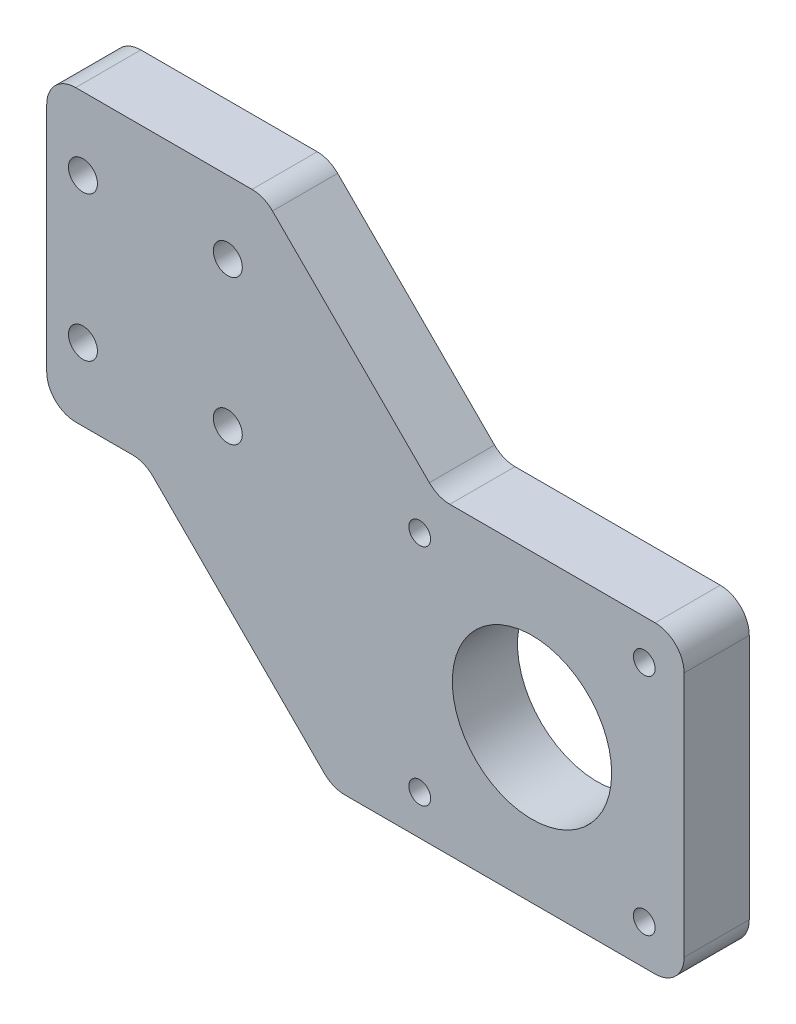
ISO-10303-21;
HEADER;
FILE_DESCRIPTION(('STEP AP214'),'2;1');
FILE_NAME('part.step','',(''),(''),'','','');
FILE_SCHEMA(('AUTOMOTIVE_DESIGN { 1 0 10303 214 1 1 1 1 }'));
ENDSEC;
DATA;
#1=APPLICATION_CONTEXT('core data for automotive mechanical design processes');
#2=APPLICATION_PROTOCOL_DEFINITION('international standard','automotive_design',2000,#1);
#3=PRODUCT_CONTEXT('',#1,'mechanical');
#4=PRODUCT('Part','Part','',(#3));
#5=PRODUCT_RELATED_PRODUCT_CATEGORY('part','',(#4));
#6=PRODUCT_DEFINITION_FORMATION('','',#4);
#7=PRODUCT_DEFINITION_CONTEXT('part definition',#1,'design');
#8=PRODUCT_DEFINITION('design','',#6,#7);
#9=PRODUCT_DEFINITION_SHAPE('','',#8);
#10=(LENGTH_UNIT() NAMED_UNIT(*) SI_UNIT(.MILLI.,.METRE.));
#11=(NAMED_UNIT(*) PLANE_ANGLE_UNIT() SI_UNIT($,.RADIAN.));
#12=(NAMED_UNIT(*) SI_UNIT($,.STERADIAN.) SOLID_ANGLE_UNIT());
#13=UNCERTAINTY_MEASURE_WITH_UNIT(LENGTH_MEASURE(1.E-05),#10,'distance_accuracy_value','');
#14=(GEOMETRIC_REPRESENTATION_CONTEXT(3) GLOBAL_UNCERTAINTY_ASSIGNED_CONTEXT((#13)) GLOBAL_UNIT_ASSIGNED_CONTEXT((#10,
#11,#12)) REPRESENTATION_CONTEXT('',''));
#15=CARTESIAN_POINT('',(0.,0.,0.));
#16=DIRECTION('',(0.,0.,1.));
#17=DIRECTION('',(1.,0.,0.));
#18=AXIS2_PLACEMENT_3D('',#15,#16,#17);
#19=CARTESIAN_POINT('',(0.,0.,9.));
#20=DIRECTION('',(1.,0.,0.));
#21=DIRECTION('',(0.,0.,-1.));
#22=AXIS2_PLACEMENT_3D('',#19,#20,#21);
#23=PLANE('',#22);
#24=DIRECTION('',(0.,-1.,0.));
#25=VECTOR('',#24,1.);
#26=CARTESIAN_POINT('',(0.,0.,0.));
#27=LINE('',#26,#25);
#28=CARTESIAN_POINT('',(0.,64.,0.));
#29=VERTEX_POINT('',#28);
#30=CARTESIAN_POINT('',(0.,32.,0.));
#31=VERTEX_POINT('',#30);
#32=EDGE_CURVE('E249',#29,#31,#27,.T.);
#33=ORIENTED_EDGE('',*,*,#32,.T.);
#34=DIRECTION('',(0.,0.,1.));
#35=VECTOR('',#34,1.);
#36=CARTESIAN_POINT('',(0.,32.,9.));
#37=LINE('',#36,#35);
#38=CARTESIAN_POINT('',(0.,32.,9.));
#39=VERTEX_POINT('',#38);
#40=EDGE_CURVE('E302',#31,#39,#37,.T.);
#41=ORIENTED_EDGE('',*,*,#40,.T.);
#42=DIRECTION('',(0.,-1.,0.));
#43=VECTOR('',#42,1.);
#44=CARTESIAN_POINT('',(0.,0.,9.));
#45=LINE('',#44,#43);
#46=CARTESIAN_POINT('',(0.,64.,9.));
#47=VERTEX_POINT('',#46);
#48=EDGE_CURVE('E252',#47,#39,#45,.T.);
#49=ORIENTED_EDGE('',*,*,#48,.F.);
#50=DIRECTION('',(0.,0.,1.));
#51=VECTOR('',#50,1.);
#52=CARTESIAN_POINT('',(0.,64.,9.));
#53=LINE('',#52,#51);
#54=EDGE_CURVE('E300',#47,#29,#53,.F.);
#55=ORIENTED_EDGE('',*,*,#54,.T.);
#56=EDGE_LOOP('',(#33,#41,#49,#55));
#57=FACE_BOUND('',#56,.T.);
#58=ADVANCED_FACE('F32',(#57),#23,.F.);
#59=CARTESIAN_POINT('',(88.,0.,9.));
#60=DIRECTION('',(-1.,0.,0.));
#61=DIRECTION('',(0.,0.,1.));
#62=AXIS2_PLACEMENT_3D('',#59,#60,#61);
#63=PLANE('',#62);
#64=DIRECTION('',(0.,1.,0.));
#65=VECTOR('',#64,1.);
#66=CARTESIAN_POINT('',(88.,0.,9.));
#67=LINE('',#66,#65);
#68=CARTESIAN_POINT('',(88.,6.00000000000001,9.));
#69=VERTEX_POINT('',#68);
#70=CARTESIAN_POINT('',(88.,40.,9.));
#71=VERTEX_POINT('',#70);
#72=EDGE_CURVE('E255',#69,#71,#67,.T.);
#73=ORIENTED_EDGE('',*,*,#72,.F.);
#74=DIRECTION('',(0.,0.,1.));
#75=VECTOR('',#74,1.);
#76=CARTESIAN_POINT('',(88.,6.00000000000001,9.));
#77=LINE('',#76,#75);
#78=CARTESIAN_POINT('',(88.,6.00000000000001,0.));
#79=VERTEX_POINT('',#78);
#80=EDGE_CURVE('E150',#69,#79,#77,.F.);
#81=ORIENTED_EDGE('',*,*,#80,.T.);
#82=DIRECTION('',(0.,1.,0.));
#83=VECTOR('',#82,1.);
#84=CARTESIAN_POINT('',(88.,0.,0.));
#85=LINE('',#84,#83);
#86=CARTESIAN_POINT('',(88.,40.,0.));
#87=VERTEX_POINT('',#86);
#88=EDGE_CURVE('E256',#79,#87,#85,.T.);
#89=ORIENTED_EDGE('',*,*,#88,.T.);
#90=DIRECTION('',(0.,0.,1.));
#91=VECTOR('',#90,1.);
#92=CARTESIAN_POINT('',(88.,40.,9.));
#93=LINE('',#92,#91);
#94=EDGE_CURVE('E155',#87,#71,#93,.T.);
#95=ORIENTED_EDGE('',*,*,#94,.T.);
#96=EDGE_LOOP('',(#73,#81,#89,#95));
#97=FACE_BOUND('',#96,.T.);
#98=ADVANCED_FACE('F341',(#97),#63,.F.);
#99=CARTESIAN_POINT('',(0.,0.,9.));
#100=DIRECTION('',(0.,0.,-1.));
#101=DIRECTION('',(-1.,0.,0.));
#102=AXIS2_PLACEMENT_3D('',#99,#100,#101);
#103=PLANE('',#102);
#104=CARTESIAN_POINT('',(82.5,7.50000000000001,9.));
#105=DIRECTION('',(0.,0.,1.));
#106=DIRECTION('',(-1.,0.,0.));
#107=AXIS2_PLACEMENT_3D('',#104,#105,#106);
#108=CIRCLE('',#107,1.5);
#109=CARTESIAN_POINT('',(81.,7.50000000000001,9.));
#110=VERTEX_POINT('',#109);
#111=EDGE_CURVE('E202',#110,#110,#108,.T.);
#112=ORIENTED_EDGE('',*,*,#111,.F.);
#113=EDGE_LOOP('',(#112));
#114=FACE_BOUND('',#113,.T.);
#115=CARTESIAN_POINT('',(51.5,7.50000000000001,9.));
#116=DIRECTION('',(0.,0.,1.));
#117=DIRECTION('',(1.,0.,0.));
#118=AXIS2_PLACEMENT_3D('',#115,#116,#117);
#119=CIRCLE('',#118,1.49999999999998);
#120=CARTESIAN_POINT('',(53.,7.50000000000001,9.));
#121=VERTEX_POINT('',#120);
#122=EDGE_CURVE('E208',#121,#121,#119,.T.);
#123=ORIENTED_EDGE('',*,*,#122,.F.);
#124=EDGE_LOOP('',(#123));
#125=FACE_BOUND('',#124,.T.);
#126=CARTESIAN_POINT('',(51.5,38.5,9.));
#127=DIRECTION('',(0.,0.,1.));
#128=DIRECTION('',(-1.,0.,0.));
#129=AXIS2_PLACEMENT_3D('',#126,#127,#128);
#130=CIRCLE('',#129,1.5);
#131=CARTESIAN_POINT('',(50.,38.5,9.));
#132=VERTEX_POINT('',#131);
#133=EDGE_CURVE('E214',#132,#132,#130,.T.);
#134=ORIENTED_EDGE('',*,*,#133,.F.);
#135=EDGE_LOOP('',(#134));
#136=FACE_BOUND('',#135,.T.);
#137=CARTESIAN_POINT('',(67.,23.,9.));
#138=DIRECTION('',(0.,0.,1.));
#139=DIRECTION('',(1.,0.,0.));
#140=AXIS2_PLACEMENT_3D('',#137,#138,#139);
#141=CIRCLE('',#140,11.);
#142=CARTESIAN_POINT('',(78.,23.,9.));
#143=VERTEX_POINT('',#142);
#144=EDGE_CURVE('E195',#143,#143,#141,.T.);
#145=ORIENTED_EDGE('',*,*,#144,.F.);
#146=EDGE_LOOP('',(#145));
#147=FACE_BOUND('',#146,.T.);
#148=CARTESIAN_POINT('',(82.5,38.5,9.));
#149=DIRECTION('',(0.,0.,1.));
#150=DIRECTION('',(1.,0.,0.));
#151=AXIS2_PLACEMENT_3D('',#148,#149,#150);
#152=CIRCLE('',#151,1.5);
#153=CARTESIAN_POINT('',(84.,38.5,9.));
#154=VERTEX_POINT('',#153);
#155=EDGE_CURVE('E201',#154,#154,#152,.T.);
#156=ORIENTED_EDGE('',*,*,#155,.F.);
#157=EDGE_LOOP('',(#156));
#158=FACE_BOUND('',#157,.T.);
#159=CARTESIAN_POINT('',(5.,38.,9.));
#160=DIRECTION('',(0.,0.,1.));
#161=DIRECTION('',(-1.,0.,0.));
#162=AXIS2_PLACEMENT_3D('',#159,#160,#161);
#163=CIRCLE('',#162,2.);
#164=CARTESIAN_POINT('',(3.,38.,9.));
#165=VERTEX_POINT('',#164);
#166=EDGE_CURVE('E232',#165,#165,#163,.T.);
#167=ORIENTED_EDGE('',*,*,#166,.F.);
#168=EDGE_LOOP('',(#167));
#169=FACE_BOUND('',#168,.T.);
#170=CARTESIAN_POINT('',(25.,38.,9.));
#171=DIRECTION('',(0.,0.,1.));
#172=DIRECTION('',(1.,0.,0.));
#173=AXIS2_PLACEMENT_3D('',#170,#171,#172);
#174=CIRCLE('',#173,2.);
#175=CARTESIAN_POINT('',(27.,38.,9.));
#176=VERTEX_POINT('',#175);
#177=EDGE_CURVE('E238',#176,#176,#174,.T.);
#178=ORIENTED_EDGE('',*,*,#177,.F.);
#179=EDGE_LOOP('',(#178));
#180=FACE_BOUND('',#179,.T.);
#181=CARTESIAN_POINT('',(25.,58.,9.));
#182=DIRECTION('',(0.,0.,1.));
#183=DIRECTION('',(-1.,0.,0.));
#184=AXIS2_PLACEMENT_3D('',#181,#182,#183);
#185=CIRCLE('',#184,2.);
#186=CARTESIAN_POINT('',(23.,58.,9.));
#187=VERTEX_POINT('',#186);
#188=EDGE_CURVE('E225',#187,#187,#185,.T.);
#189=ORIENTED_EDGE('',*,*,#188,.F.);
#190=EDGE_LOOP('',(#189));
#191=FACE_BOUND('',#190,.T.);
#192=CARTESIAN_POINT('',(4.99999999999999,58.,9.));
#193=DIRECTION('',(0.,0.,1.));
#194=DIRECTION('',(1.,0.,0.));
#195=AXIS2_PLACEMENT_3D('',#192,#193,#194);
#196=CIRCLE('',#195,2.);
#197=CARTESIAN_POINT('',(7.,58.,9.));
#198=VERTEX_POINT('',#197);
#199=EDGE_CURVE('E231',#198,#198,#196,.T.);
#200=ORIENTED_EDGE('',*,*,#199,.F.);
#201=EDGE_LOOP('',(#200));
#202=FACE_BOUND('',#201,.T.);
#203=DIRECTION('',(-1.,0.,0.));
#204=VECTOR('',#203,1.);
#205=CARTESIAN_POINT('',(41.5,2.00000000000001,9.));
#206=LINE('',#205,#204);
#207=CARTESIAN_POINT('',(84.,2.00000000000001,9.));
#208=VERTEX_POINT('',#207);
#209=CARTESIAN_POINT('',(41.1568542494921,2.00000000000001,9.));
#210=VERTEX_POINT('',#209);
#211=EDGE_CURVE('E163',#208,#210,#206,.T.);
#212=ORIENTED_EDGE('',*,*,#211,.F.);
#213=CARTESIAN_POINT('',(84.,6.00000000000001,9.));
#214=DIRECTION('',(0.,0.,-1.));
#215=DIRECTION('',(-1.,0.,0.));
#216=AXIS2_PLACEMENT_3D('',#213,#214,#215);
#217=CIRCLE('',#216,4.);
#218=EDGE_CURVE('E145',#208,#69,#217,.F.);
#219=ORIENTED_EDGE('',*,*,#218,.T.);
#220=ORIENTED_EDGE('',*,*,#72,.T.);
#221=CARTESIAN_POINT('',(84.,40.,9.));
#222=DIRECTION('',(0.,0.,-1.));
#223=DIRECTION('',(-1.,0.,0.));
#224=AXIS2_PLACEMENT_3D('',#221,#222,#223);
#225=CIRCLE('',#224,4.);
#226=CARTESIAN_POINT('',(84.,44.,9.));
#227=VERTEX_POINT('',#226);
#228=EDGE_CURVE('E271',#71,#227,#225,.F.);
#229=ORIENTED_EDGE('',*,*,#228,.T.);
#230=DIRECTION('',(1.,0.,0.));
#231=VECTOR('',#230,1.);
#232=CARTESIAN_POINT('',(53.9999999999999,44.,9.));
#233=LINE('',#232,#231);
#234=CARTESIAN_POINT('',(55.6568542494923,44.,9.));
#235=VERTEX_POINT('',#234);
#236=EDGE_CURVE('E186',#235,#227,#233,.T.);
#237=ORIENTED_EDGE('',*,*,#236,.F.);
#238=CARTESIAN_POINT('',(55.6568542494923,48.,9.));
#239=DIRECTION('',(0.,0.,-1.));
#240=DIRECTION('',(-1.,0.,0.));
#241=AXIS2_PLACEMENT_3D('',#238,#239,#240);
#242=CIRCLE('',#241,4.);
#243=CARTESIAN_POINT('',(52.8284271247461,45.1715728752538,9.));
#244=VERTEX_POINT('',#243);
#245=EDGE_CURVE('E40',#235,#244,#242,.T.);
#246=ORIENTED_EDGE('',*,*,#245,.T.);
#247=DIRECTION('',(0.707106781186546,-0.707106781186549,0.));
#248=VECTOR('',#247,1.);
#249=CARTESIAN_POINT('',(30.,68.,9.));
#250=LINE('',#249,#248);
#251=CARTESIAN_POINT('',(31.1715728752538,66.8284271247462,9.));
#252=VERTEX_POINT('',#251);
#253=EDGE_CURVE('E180',#252,#244,#250,.T.);
#254=ORIENTED_EDGE('',*,*,#253,.F.);
#255=CARTESIAN_POINT('',(28.3431457505076,64.,9.));
#256=DIRECTION('',(0.,0.,-1.));
#257=DIRECTION('',(-1.,0.,0.));
#258=AXIS2_PLACEMENT_3D('',#255,#256,#257);
#259=CIRCLE('',#258,4.);
#260=CARTESIAN_POINT('',(28.3431457505076,68.,9.));
#261=VERTEX_POINT('',#260);
#262=EDGE_CURVE('E269',#252,#261,#259,.F.);
#263=ORIENTED_EDGE('',*,*,#262,.T.);
#264=DIRECTION('',(1.,0.,0.));
#265=VECTOR('',#264,1.);
#266=CARTESIAN_POINT('',(0.,68.,9.));
#267=LINE('',#266,#265);
#268=CARTESIAN_POINT('',(4.,68.,9.));
#269=VERTEX_POINT('',#268);
#270=EDGE_CURVE('E188',#269,#261,#267,.T.);
#271=ORIENTED_EDGE('',*,*,#270,.F.);
#272=CARTESIAN_POINT('',(4.,64.,9.));
#273=DIRECTION('',(0.,0.,-1.));
#274=DIRECTION('',(-1.,0.,0.));
#275=AXIS2_PLACEMENT_3D('',#272,#273,#274);
#276=CIRCLE('',#275,4.);
#277=EDGE_CURVE('E167',#269,#47,#276,.F.);
#278=ORIENTED_EDGE('',*,*,#277,.T.);
#279=ORIENTED_EDGE('',*,*,#48,.T.);
#280=CARTESIAN_POINT('',(4.,32.,9.));
#281=DIRECTION('',(0.,0.,-1.));
#282=DIRECTION('',(-1.,0.,0.));
#283=AXIS2_PLACEMENT_3D('',#280,#281,#282);
#284=CIRCLE('',#283,4.);
#285=CARTESIAN_POINT('',(4.,28.,9.));
#286=VERTEX_POINT('',#285);
#287=EDGE_CURVE('E273',#39,#286,#284,.F.);
#288=ORIENTED_EDGE('',*,*,#287,.T.);
#289=DIRECTION('',(-1.,0.,0.));
#290=VECTOR('',#289,1.);
#291=CARTESIAN_POINT('',(0.,28.,9.));
#292=LINE('',#291,#290);
#293=CARTESIAN_POINT('',(11.8431457505071,28.,9.));
#294=VERTEX_POINT('',#293);
#295=EDGE_CURVE('E174',#294,#286,#292,.T.);
#296=ORIENTED_EDGE('',*,*,#295,.F.);
#297=CARTESIAN_POINT('',(11.8431457505071,24.,9.));
#298=DIRECTION('',(0.,0.,-1.));
#299=DIRECTION('',(-1.,0.,0.));
#300=AXIS2_PLACEMENT_3D('',#297,#298,#299);
#301=CIRCLE('',#300,4.);
#302=CARTESIAN_POINT('',(14.6715728752533,26.8284271247462,9.));
#303=VERTEX_POINT('',#302);
#304=EDGE_CURVE('E319',#294,#303,#301,.T.);
#305=ORIENTED_EDGE('',*,*,#304,.T.);
#306=DIRECTION('',(-0.707106781186551,0.707106781186544,0.));
#307=VECTOR('',#306,1.);
#308=CARTESIAN_POINT('',(20.7499999999997,20.7499999999999,9.));
#309=LINE('',#308,#307);
#310=CARTESIAN_POINT('',(38.328427124746,3.17157287525379,9.));
#311=VERTEX_POINT('',#310);
#312=EDGE_CURVE('E258',#303,#311,#309,.F.);
#313=ORIENTED_EDGE('',*,*,#312,.T.);
#314=CARTESIAN_POINT('',(41.1568542494921,6.00000000000001,9.));
#315=DIRECTION('',(0.,0.,-1.));
#316=DIRECTION('',(-1.,0.,0.));
#317=AXIS2_PLACEMENT_3D('',#314,#315,#316);
#318=CIRCLE('',#317,4.);
#319=EDGE_CURVE('E156',#311,#210,#318,.F.);
#320=ORIENTED_EDGE('',*,*,#319,.T.);
#321=EDGE_LOOP('',(#212,#219,#220,#229,#237,#246,#254,#263,#271,#278,#279,#288,#296,#305,#313,#320));
#322=FACE_BOUND('',#321,.T.);
#323=ADVANCED_FACE('F170',(#114,#125,#136,#147,#158,#169,#180,#191,#202,#322),#103,.F.);
#324=CARTESIAN_POINT('',(0.,0.,0.));
#325=DIRECTION('',(0.,0.,-1.));
#326=DIRECTION('',(-1.,0.,0.));
#327=AXIS2_PLACEMENT_3D('',#324,#325,#326);
#328=PLANE('',#327);
#329=ORIENTED_EDGE('',*,*,#88,.F.);
#330=CARTESIAN_POINT('',(84.,6.00000000000001,0.));
#331=DIRECTION('',(0.,0.,-1.));
#332=DIRECTION('',(-1.,0.,0.));
#333=AXIS2_PLACEMENT_3D('',#330,#331,#332);
#334=CIRCLE('',#333,4.);
#335=CARTESIAN_POINT('',(84.,2.00000000000001,0.));
#336=VERTEX_POINT('',#335);
#337=EDGE_CURVE('E289',#79,#336,#334,.T.);
#338=ORIENTED_EDGE('',*,*,#337,.T.);
#339=DIRECTION('',(-1.,0.,0.));
#340=VECTOR('',#339,1.);
#341=CARTESIAN_POINT('',(41.5,2.00000000000001,0.));
#342=LINE('',#341,#340);
#343=CARTESIAN_POINT('',(41.1568542494921,2.00000000000001,0.));
#344=VERTEX_POINT('',#343);
#345=EDGE_CURVE('E166',#336,#344,#342,.T.);
#346=ORIENTED_EDGE('',*,*,#345,.T.);
#347=CARTESIAN_POINT('',(41.1568542494921,6.00000000000001,0.));
#348=DIRECTION('',(0.,0.,-1.));
#349=DIRECTION('',(-1.,0.,0.));
#350=AXIS2_PLACEMENT_3D('',#347,#348,#349);
#351=CIRCLE('',#350,4.);
#352=CARTESIAN_POINT('',(38.328427124746,3.1715728752538,0.));
#353=VERTEX_POINT('',#352);
#354=EDGE_CURVE('E287',#344,#353,#351,.T.);
#355=ORIENTED_EDGE('',*,*,#354,.T.);
#356=DIRECTION('',(0.707106781186551,-0.707106781186544,0.));
#357=VECTOR('',#356,1.);
#358=CARTESIAN_POINT('',(13.4999999999995,28.,0.));
#359=LINE('',#358,#357);
#360=CARTESIAN_POINT('',(14.6715728752533,26.8284271247462,0.));
#361=VERTEX_POINT('',#360);
#362=EDGE_CURVE('E264',#353,#361,#359,.F.);
#363=ORIENTED_EDGE('',*,*,#362,.T.);
#364=CARTESIAN_POINT('',(11.8431457505071,24.,0.));
#365=DIRECTION('',(0.,0.,-1.));
#366=DIRECTION('',(-1.,0.,0.));
#367=AXIS2_PLACEMENT_3D('',#364,#365,#366);
#368=CIRCLE('',#367,4.);
#369=CARTESIAN_POINT('',(11.8431457505071,28.,0.));
#370=VERTEX_POINT('',#369);
#371=EDGE_CURVE('E321',#361,#370,#368,.F.);
#372=ORIENTED_EDGE('',*,*,#371,.T.);
#373=DIRECTION('',(-1.,0.,0.));
#374=VECTOR('',#373,1.);
#375=CARTESIAN_POINT('',(0.,28.,0.));
#376=LINE('',#375,#374);
#377=CARTESIAN_POINT('',(4.,28.,0.));
#378=VERTEX_POINT('',#377);
#379=EDGE_CURVE('E177',#370,#378,#376,.T.);
#380=ORIENTED_EDGE('',*,*,#379,.T.);
#381=CARTESIAN_POINT('',(4.,32.,0.));
#382=DIRECTION('',(0.,0.,-1.));
#383=DIRECTION('',(-1.,0.,0.));
#384=AXIS2_PLACEMENT_3D('',#381,#382,#383);
#385=CIRCLE('',#384,4.);
#386=EDGE_CURVE('E285',#378,#31,#385,.T.);
#387=ORIENTED_EDGE('',*,*,#386,.T.);
#388=ORIENTED_EDGE('',*,*,#32,.F.);
#389=CARTESIAN_POINT('',(4.,64.,0.));
#390=DIRECTION('',(0.,0.,-1.));
#391=DIRECTION('',(-1.,0.,0.));
#392=AXIS2_PLACEMENT_3D('',#389,#390,#391);
#393=CIRCLE('',#392,4.);
#394=CARTESIAN_POINT('',(4.,68.,0.));
#395=VERTEX_POINT('',#394);
#396=EDGE_CURVE('E279',#29,#395,#393,.T.);
#397=ORIENTED_EDGE('',*,*,#396,.T.);
#398=DIRECTION('',(1.,0.,0.));
#399=VECTOR('',#398,1.);
#400=CARTESIAN_POINT('',(0.,68.,0.));
#401=LINE('',#400,#399);
#402=CARTESIAN_POINT('',(28.3431457505076,68.,0.));
#403=VERTEX_POINT('',#402);
#404=EDGE_CURVE('E192',#395,#403,#401,.T.);
#405=ORIENTED_EDGE('',*,*,#404,.T.);
#406=CARTESIAN_POINT('',(28.3431457505076,64.,0.));
#407=DIRECTION('',(0.,0.,-1.));
#408=DIRECTION('',(-1.,0.,0.));
#409=AXIS2_PLACEMENT_3D('',#406,#407,#408);
#410=CIRCLE('',#409,4.);
#411=CARTESIAN_POINT('',(31.1715728752538,66.8284271247462,0.));
#412=VERTEX_POINT('',#411);
#413=EDGE_CURVE('E281',#403,#412,#410,.T.);
#414=ORIENTED_EDGE('',*,*,#413,.T.);
#415=DIRECTION('',(0.707106781186546,-0.707106781186549,0.));
#416=VECTOR('',#415,1.);
#417=CARTESIAN_POINT('',(30.,68.,0.));
#418=LINE('',#417,#416);
#419=CARTESIAN_POINT('',(52.8284271247461,45.1715728752538,0.));
#420=VERTEX_POINT('',#419);
#421=EDGE_CURVE('E183',#412,#420,#418,.T.);
#422=ORIENTED_EDGE('',*,*,#421,.T.);
#423=CARTESIAN_POINT('',(55.6568542494923,48.,0.));
#424=DIRECTION('',(0.,0.,-1.));
#425=DIRECTION('',(-1.,0.,0.));
#426=AXIS2_PLACEMENT_3D('',#423,#424,#425);
#427=CIRCLE('',#426,4.);
#428=CARTESIAN_POINT('',(55.6568542494923,44.,0.));
#429=VERTEX_POINT('',#428);
#430=EDGE_CURVE('E11',#420,#429,#427,.F.);
#431=ORIENTED_EDGE('',*,*,#430,.T.);
#432=DIRECTION('',(1.,0.,0.));
#433=VECTOR('',#432,1.);
#434=CARTESIAN_POINT('',(53.9999999999999,44.,0.));
#435=LINE('',#434,#433);
#436=CARTESIAN_POINT('',(84.,44.,0.));
#437=VERTEX_POINT('',#436);
#438=EDGE_CURVE('E185',#429,#437,#435,.T.);
#439=ORIENTED_EDGE('',*,*,#438,.T.);
#440=CARTESIAN_POINT('',(84.,40.,0.));
#441=DIRECTION('',(0.,0.,-1.));
#442=DIRECTION('',(-1.,0.,0.));
#443=AXIS2_PLACEMENT_3D('',#440,#441,#442);
#444=CIRCLE('',#443,4.);
#445=EDGE_CURVE('E283',#437,#87,#444,.T.);
#446=ORIENTED_EDGE('',*,*,#445,.T.);
#447=EDGE_LOOP('',(#329,#338,#346,#355,#363,#372,#380,#387,#388,#397,#405,#414,#422,#431,#439,#446));
#448=FACE_BOUND('',#447,.T.);
#449=CARTESIAN_POINT('',(82.5,7.50000000000001,0.));
#450=DIRECTION('',(0.,0.,1.));
#451=DIRECTION('',(-1.,0.,0.));
#452=AXIS2_PLACEMENT_3D('',#449,#450,#451);
#453=CIRCLE('',#452,1.5);
#454=CARTESIAN_POINT('',(81.,7.50000000000001,0.));
#455=VERTEX_POINT('',#454);
#456=EDGE_CURVE('E198',#455,#455,#453,.T.);
#457=ORIENTED_EDGE('',*,*,#456,.T.);
#458=EDGE_LOOP('',(#457));
#459=FACE_BOUND('',#458,.T.);
#460=CARTESIAN_POINT('',(51.5,7.50000000000001,0.));
#461=DIRECTION('',(0.,0.,1.));
#462=DIRECTION('',(1.,0.,0.));
#463=AXIS2_PLACEMENT_3D('',#460,#461,#462);
#464=CIRCLE('',#463,1.49999999999998);
#465=CARTESIAN_POINT('',(53.,7.50000000000001,0.));
#466=VERTEX_POINT('',#465);
#467=EDGE_CURVE('E205',#466,#466,#464,.T.);
#468=ORIENTED_EDGE('',*,*,#467,.T.);
#469=EDGE_LOOP('',(#468));
#470=FACE_BOUND('',#469,.T.);
#471=CARTESIAN_POINT('',(51.5,38.5,0.));
#472=DIRECTION('',(0.,0.,1.));
#473=DIRECTION('',(-1.,0.,0.));
#474=AXIS2_PLACEMENT_3D('',#471,#472,#473);
#475=CIRCLE('',#474,1.5);
#476=CARTESIAN_POINT('',(50.,38.5,0.));
#477=VERTEX_POINT('',#476);
#478=EDGE_CURVE('E211',#477,#477,#475,.T.);
#479=ORIENTED_EDGE('',*,*,#478,.T.);
#480=EDGE_LOOP('',(#479));
#481=FACE_BOUND('',#480,.T.);
#482=CARTESIAN_POINT('',(67.,23.,0.));
#483=DIRECTION('',(0.,0.,1.));
#484=DIRECTION('',(1.,0.,0.));
#485=AXIS2_PLACEMENT_3D('',#482,#483,#484);
#486=CIRCLE('',#485,11.);
#487=CARTESIAN_POINT('',(78.,23.,0.));
#488=VERTEX_POINT('',#487);
#489=EDGE_CURVE('E217',#488,#488,#486,.T.);
#490=ORIENTED_EDGE('',*,*,#489,.T.);
#491=EDGE_LOOP('',(#490));
#492=FACE_BOUND('',#491,.T.);
#493=CARTESIAN_POINT('',(82.5,38.5,0.));
#494=DIRECTION('',(0.,0.,1.));
#495=DIRECTION('',(1.,0.,0.));
#496=AXIS2_PLACEMENT_3D('',#493,#494,#495);
#497=CIRCLE('',#496,1.5);
#498=CARTESIAN_POINT('',(84.,38.5,0.));
#499=VERTEX_POINT('',#498);
#500=EDGE_CURVE('E222',#499,#499,#497,.T.);
#501=ORIENTED_EDGE('',*,*,#500,.T.);
#502=EDGE_LOOP('',(#501));
#503=FACE_BOUND('',#502,.T.);
#504=CARTESIAN_POINT('',(5.,38.,0.));
#505=DIRECTION('',(0.,0.,1.));
#506=DIRECTION('',(-1.,0.,0.));
#507=AXIS2_PLACEMENT_3D('',#504,#505,#506);
#508=CIRCLE('',#507,2.);
#509=CARTESIAN_POINT('',(3.,38.,0.));
#510=VERTEX_POINT('',#509);
#511=EDGE_CURVE('E228',#510,#510,#508,.T.);
#512=ORIENTED_EDGE('',*,*,#511,.T.);
#513=EDGE_LOOP('',(#512));
#514=FACE_BOUND('',#513,.T.);
#515=CARTESIAN_POINT('',(25.,38.,0.));
#516=DIRECTION('',(0.,0.,1.));
#517=DIRECTION('',(1.,0.,0.));
#518=AXIS2_PLACEMENT_3D('',#515,#516,#517);
#519=CIRCLE('',#518,2.);
#520=CARTESIAN_POINT('',(27.,38.,0.));
#521=VERTEX_POINT('',#520);
#522=EDGE_CURVE('E235',#521,#521,#519,.T.);
#523=ORIENTED_EDGE('',*,*,#522,.T.);
#524=EDGE_LOOP('',(#523));
#525=FACE_BOUND('',#524,.T.);
#526=CARTESIAN_POINT('',(25.,58.,0.));
#527=DIRECTION('',(0.,0.,1.));
#528=DIRECTION('',(-1.,0.,0.));
#529=AXIS2_PLACEMENT_3D('',#526,#527,#528);
#530=CIRCLE('',#529,2.);
#531=CARTESIAN_POINT('',(23.,58.,0.));
#532=VERTEX_POINT('',#531);
#533=EDGE_CURVE('E241',#532,#532,#530,.T.);
#534=ORIENTED_EDGE('',*,*,#533,.T.);
#535=EDGE_LOOP('',(#534));
#536=FACE_BOUND('',#535,.T.);
#537=CARTESIAN_POINT('',(4.99999999999999,58.,0.));
#538=DIRECTION('',(0.,0.,1.));
#539=DIRECTION('',(1.,0.,0.));
#540=AXIS2_PLACEMENT_3D('',#537,#538,#539);
#541=CIRCLE('',#540,2.);
#542=CARTESIAN_POINT('',(7.,58.,0.));
#543=VERTEX_POINT('',#542);
#544=EDGE_CURVE('E246',#543,#543,#541,.T.);
#545=ORIENTED_EDGE('',*,*,#544,.T.);
#546=EDGE_LOOP('',(#545));
#547=FACE_BOUND('',#546,.T.);
#548=ADVANCED_FACE('F335',(#448,#459,#470,#481,#492,#503,#514,#525,#536,#547),#328,.T.);
#549=CARTESIAN_POINT('',(4.99999999999999,58.,0.));
#550=DIRECTION('',(0.,0.,1.));
#551=DIRECTION('',(1.,0.,0.));
#552=AXIS2_PLACEMENT_3D('',#549,#550,#551);
#553=CYLINDRICAL_SURFACE('',#552,2.);
#554=ORIENTED_EDGE('',*,*,#544,.F.);
#555=EDGE_LOOP('',(#554));
#556=FACE_BOUND('',#555,.T.);
#557=ORIENTED_EDGE('',*,*,#199,.T.);
#558=EDGE_LOOP('',(#557));
#559=FACE_BOUND('',#558,.T.);
#560=ADVANCED_FACE('F422',(#556,#559),#553,.F.);
#561=CARTESIAN_POINT('',(25.,58.,0.));
#562=DIRECTION('',(0.,0.,1.));
#563=DIRECTION('',(1.,0.,0.));
#564=AXIS2_PLACEMENT_3D('',#561,#562,#563);
#565=CYLINDRICAL_SURFACE('',#564,2.);
#566=ORIENTED_EDGE('',*,*,#533,.F.);
#567=EDGE_LOOP('',(#566));
#568=FACE_BOUND('',#567,.T.);
#569=ORIENTED_EDGE('',*,*,#188,.T.);
#570=EDGE_LOOP('',(#569));
#571=FACE_BOUND('',#570,.T.);
#572=ADVANCED_FACE('F418',(#568,#571),#565,.F.);
#573=CARTESIAN_POINT('',(25.,38.,0.));
#574=DIRECTION('',(0.,0.,1.));
#575=DIRECTION('',(1.,0.,0.));
#576=AXIS2_PLACEMENT_3D('',#573,#574,#575);
#577=CYLINDRICAL_SURFACE('',#576,2.);
#578=ORIENTED_EDGE('',*,*,#522,.F.);
#579=EDGE_LOOP('',(#578));
#580=FACE_BOUND('',#579,.T.);
#581=ORIENTED_EDGE('',*,*,#177,.T.);
#582=EDGE_LOOP('',(#581));
#583=FACE_BOUND('',#582,.T.);
#584=ADVANCED_FACE('F414',(#580,#583),#577,.F.);
#585=CARTESIAN_POINT('',(5.,38.,0.));
#586=DIRECTION('',(0.,0.,1.));
#587=DIRECTION('',(1.,0.,0.));
#588=AXIS2_PLACEMENT_3D('',#585,#586,#587);
#589=CYLINDRICAL_SURFACE('',#588,2.);
#590=ORIENTED_EDGE('',*,*,#511,.F.);
#591=EDGE_LOOP('',(#590));
#592=FACE_BOUND('',#591,.T.);
#593=ORIENTED_EDGE('',*,*,#166,.T.);
#594=EDGE_LOOP('',(#593));
#595=FACE_BOUND('',#594,.T.);
#596=ADVANCED_FACE('F410',(#592,#595),#589,.F.);
#597=CARTESIAN_POINT('',(82.5,38.5,0.));
#598=DIRECTION('',(0.,0.,1.));
#599=DIRECTION('',(1.,0.,0.));
#600=AXIS2_PLACEMENT_3D('',#597,#598,#599);
#601=CYLINDRICAL_SURFACE('',#600,1.5);
#602=ORIENTED_EDGE('',*,*,#500,.F.);
#603=EDGE_LOOP('',(#602));
#604=FACE_BOUND('',#603,.T.);
#605=ORIENTED_EDGE('',*,*,#155,.T.);
#606=EDGE_LOOP('',(#605));
#607=FACE_BOUND('',#606,.T.);
#608=ADVANCED_FACE('F406',(#604,#607),#601,.F.);
#609=CARTESIAN_POINT('',(67.,23.,0.));
#610=DIRECTION('',(0.,0.,1.));
#611=DIRECTION('',(1.,0.,0.));
#612=AXIS2_PLACEMENT_3D('',#609,#610,#611);
#613=CYLINDRICAL_SURFACE('',#612,11.);
#614=ORIENTED_EDGE('',*,*,#489,.F.);
#615=EDGE_LOOP('',(#614));
#616=FACE_BOUND('',#615,.T.);
#617=ORIENTED_EDGE('',*,*,#144,.T.);
#618=EDGE_LOOP('',(#617));
#619=FACE_BOUND('',#618,.T.);
#620=ADVANCED_FACE('F402',(#616,#619),#613,.F.);
#621=CARTESIAN_POINT('',(51.5,38.5,0.));
#622=DIRECTION('',(0.,0.,1.));
#623=DIRECTION('',(1.,0.,0.));
#624=AXIS2_PLACEMENT_3D('',#621,#622,#623);
#625=CYLINDRICAL_SURFACE('',#624,1.5);
#626=ORIENTED_EDGE('',*,*,#478,.F.);
#627=EDGE_LOOP('',(#626));
#628=FACE_BOUND('',#627,.T.);
#629=ORIENTED_EDGE('',*,*,#133,.T.);
#630=EDGE_LOOP('',(#629));
#631=FACE_BOUND('',#630,.T.);
#632=ADVANCED_FACE('F398',(#628,#631),#625,.F.);
#633=CARTESIAN_POINT('',(51.5,7.50000000000001,0.));
#634=DIRECTION('',(0.,0.,1.));
#635=DIRECTION('',(1.,0.,0.));
#636=AXIS2_PLACEMENT_3D('',#633,#634,#635);
#637=CYLINDRICAL_SURFACE('',#636,1.49999999999998);
#638=ORIENTED_EDGE('',*,*,#467,.F.);
#639=EDGE_LOOP('',(#638));
#640=FACE_BOUND('',#639,.T.);
#641=ORIENTED_EDGE('',*,*,#122,.T.);
#642=EDGE_LOOP('',(#641));
#643=FACE_BOUND('',#642,.T.);
#644=ADVANCED_FACE('F394',(#640,#643),#637,.F.);
#645=CARTESIAN_POINT('',(82.5,7.50000000000001,0.));
#646=DIRECTION('',(0.,0.,1.));
#647=DIRECTION('',(1.,0.,0.));
#648=AXIS2_PLACEMENT_3D('',#645,#646,#647);
#649=CYLINDRICAL_SURFACE('',#648,1.5);
#650=ORIENTED_EDGE('',*,*,#456,.F.);
#651=EDGE_LOOP('',(#650));
#652=FACE_BOUND('',#651,.T.);
#653=ORIENTED_EDGE('',*,*,#111,.T.);
#654=EDGE_LOOP('',(#653));
#655=FACE_BOUND('',#654,.T.);
#656=ADVANCED_FACE('F390',(#652,#655),#649,.F.);
#657=CARTESIAN_POINT('',(0.,68.,0.));
#658=DIRECTION('',(0.,-1.,0.));
#659=DIRECTION('',(0.,0.,-1.));
#660=AXIS2_PLACEMENT_3D('',#657,#658,#659);
#661=PLANE('',#660);
#662=ORIENTED_EDGE('',*,*,#270,.T.);
#663=DIRECTION('',(0.,0.,1.));
#664=VECTOR('',#663,1.);
#665=CARTESIAN_POINT('',(28.3431457505076,68.,0.));
#666=LINE('',#665,#664);
#667=EDGE_CURVE('E317',#261,#403,#666,.F.);
#668=ORIENTED_EDGE('',*,*,#667,.T.);
#669=ORIENTED_EDGE('',*,*,#404,.F.);
#670=DIRECTION('',(0.,0.,1.));
#671=VECTOR('',#670,1.);
#672=CARTESIAN_POINT('',(4.,68.,0.));
#673=LINE('',#672,#671);
#674=EDGE_CURVE('E314',#395,#269,#673,.T.);
#675=ORIENTED_EDGE('',*,*,#674,.T.);
#676=EDGE_LOOP('',(#662,#668,#669,#675));
#677=FACE_BOUND('',#676,.T.);
#678=ADVANCED_FACE('F385',(#677),#661,.F.);
#679=CARTESIAN_POINT('',(53.9999999999999,44.,0.));
#680=DIRECTION('',(0.,-1.,0.));
#681=DIRECTION('',(1.,0.,0.));
#682=AXIS2_PLACEMENT_3D('',#679,#680,#681);
#683=PLANE('',#682);
#684=ORIENTED_EDGE('',*,*,#236,.T.);
#685=DIRECTION('',(0.,0.,1.));
#686=VECTOR('',#685,1.);
#687=CARTESIAN_POINT('',(84.,44.,0.));
#688=LINE('',#687,#686);
#689=EDGE_CURVE('E47',#227,#437,#688,.F.);
#690=ORIENTED_EDGE('',*,*,#689,.T.);
#691=ORIENTED_EDGE('',*,*,#438,.F.);
#692=DIRECTION('',(0.,0.,1.));
#693=VECTOR('',#692,1.);
#694=CARTESIAN_POINT('',(55.6568542494923,44.,9.));
#695=LINE('',#694,#693);
#696=EDGE_CURVE('E305',#429,#235,#695,.T.);
#697=ORIENTED_EDGE('',*,*,#696,.T.);
#698=EDGE_LOOP('',(#684,#690,#691,#697));
#699=FACE_BOUND('',#698,.T.);
#700=ADVANCED_FACE('F332',(#699),#683,.F.);
#701=CARTESIAN_POINT('',(30.,68.,0.));
#702=DIRECTION('',(-0.707106781186549,-0.707106781186546,0.));
#703=DIRECTION('',(0.707106781186546,-0.707106781186549,0.));
#704=AXIS2_PLACEMENT_3D('',#701,#702,#703);
#705=PLANE('',#704);
#706=ORIENTED_EDGE('',*,*,#253,.T.);
#707=DIRECTION('',(0.,0.,1.));
#708=VECTOR('',#707,1.);
#709=CARTESIAN_POINT('',(52.8284271247461,45.1715728752538,0.));
#710=LINE('',#709,#708);
#711=EDGE_CURVE('E312',#244,#420,#710,.F.);
#712=ORIENTED_EDGE('',*,*,#711,.T.);
#713=ORIENTED_EDGE('',*,*,#421,.F.);
#714=DIRECTION('',(0.,0.,1.));
#715=VECTOR('',#714,1.);
#716=CARTESIAN_POINT('',(31.1715728752538,66.8284271247462,0.));
#717=LINE('',#716,#715);
#718=EDGE_CURVE('E309',#412,#252,#717,.T.);
#719=ORIENTED_EDGE('',*,*,#718,.T.);
#720=EDGE_LOOP('',(#706,#712,#713,#719));
#721=FACE_BOUND('',#720,.T.);
#722=ADVANCED_FACE('F328',(#721),#705,.F.);
#723=CARTESIAN_POINT('',(0.,28.,0.));
#724=DIRECTION('',(0.,1.,0.));
#725=DIRECTION('',(0.,0.,1.));
#726=AXIS2_PLACEMENT_3D('',#723,#724,#725);
#727=PLANE('',#726);
#728=ORIENTED_EDGE('',*,*,#379,.F.);
#729=DIRECTION('',(0.,0.,-1.));
#730=VECTOR('',#729,1.);
#731=CARTESIAN_POINT('',(11.8431457505071,28.,9.));
#732=LINE('',#731,#730);
#733=EDGE_CURVE('E297',#370,#294,#732,.F.);
#734=ORIENTED_EDGE('',*,*,#733,.T.);
#735=ORIENTED_EDGE('',*,*,#295,.T.);
#736=DIRECTION('',(0.,0.,1.));
#737=VECTOR('',#736,1.);
#738=CARTESIAN_POINT('',(4.,28.,0.));
#739=LINE('',#738,#737);
#740=EDGE_CURVE('E295',#286,#378,#739,.F.);
#741=ORIENTED_EDGE('',*,*,#740,.T.);
#742=EDGE_LOOP('',(#728,#734,#735,#741));
#743=FACE_BOUND('',#742,.T.);
#744=ADVANCED_FACE('F375',(#743),#727,.F.);
#745=CARTESIAN_POINT('',(41.5,2.00000000000001,0.));
#746=DIRECTION('',(0.,1.,0.));
#747=DIRECTION('',(0.,0.,1.));
#748=AXIS2_PLACEMENT_3D('',#745,#746,#747);
#749=PLANE('',#748);
#750=ORIENTED_EDGE('',*,*,#345,.F.);
#751=DIRECTION('',(0.,0.,1.));
#752=VECTOR('',#751,1.);
#753=CARTESIAN_POINT('',(84.,2.00000000000001,0.));
#754=LINE('',#753,#752);
#755=EDGE_CURVE('E149',#336,#208,#754,.T.);
#756=ORIENTED_EDGE('',*,*,#755,.T.);
#757=ORIENTED_EDGE('',*,*,#211,.T.);
#758=DIRECTION('',(0.,0.,1.));
#759=VECTOR('',#758,1.);
#760=CARTESIAN_POINT('',(41.1568542494921,2.00000000000001,0.));
#761=LINE('',#760,#759);
#762=EDGE_CURVE('E168',#210,#344,#761,.F.);
#763=ORIENTED_EDGE('',*,*,#762,.T.);
#764=EDGE_LOOP('',(#750,#756,#757,#763));
#765=FACE_BOUND('',#764,.T.);
#766=ADVANCED_FACE('F161',(#765),#749,.F.);
#767=CARTESIAN_POINT('',(13.4999999999995,28.,0.));
#768=DIRECTION('',(-0.707106781186544,-0.707106781186551,0.));
#769=DIRECTION('',(0.,0.,-1.));
#770=AXIS2_PLACEMENT_3D('',#767,#768,#769);
#771=PLANE('',#770);
#772=ORIENTED_EDGE('',*,*,#362,.F.);
#773=DIRECTION('',(0.,0.,-1.));
#774=VECTOR('',#773,1.);
#775=CARTESIAN_POINT('',(38.328427124746,3.1715728752538,0.));
#776=LINE('',#775,#774);
#777=EDGE_CURVE('E293',#353,#311,#776,.F.);
#778=ORIENTED_EDGE('',*,*,#777,.T.);
#779=ORIENTED_EDGE('',*,*,#312,.F.);
#780=DIRECTION('',(0.,0.,1.));
#781=VECTOR('',#780,1.);
#782=CARTESIAN_POINT('',(14.6715728752533,26.8284271247462,0.));
#783=LINE('',#782,#781);
#784=EDGE_CURVE('E291',#303,#361,#783,.F.);
#785=ORIENTED_EDGE('',*,*,#784,.T.);
#786=EDGE_LOOP('',(#772,#778,#779,#785));
#787=FACE_BOUND('',#786,.T.);
#788=ADVANCED_FACE('F347',(#787),#771,.T.);
#789=CARTESIAN_POINT('',(84.,6.00000000000001,0.));
#790=DIRECTION('',(0.,0.,1.));
#791=DIRECTION('',(1.,0.,0.));
#792=AXIS2_PLACEMENT_3D('',#789,#790,#791);
#793=CYLINDRICAL_SURFACE('',#792,4.);
#794=ORIENTED_EDGE('',*,*,#337,.F.);
#795=ORIENTED_EDGE('',*,*,#80,.F.);
#796=ORIENTED_EDGE('',*,*,#218,.F.);
#797=ORIENTED_EDGE('',*,*,#755,.F.);
#798=EDGE_LOOP('',(#794,#795,#796,#797));
#799=FACE_BOUND('',#798,.T.);
#800=ADVANCED_FACE('F148',(#799),#793,.T.);
#801=CARTESIAN_POINT('',(41.1568542494921,6.00000000000001,0.));
#802=DIRECTION('',(0.,0.,1.));
#803=DIRECTION('',(1.,0.,0.));
#804=AXIS2_PLACEMENT_3D('',#801,#802,#803);
#805=CYLINDRICAL_SURFACE('',#804,4.);
#806=ORIENTED_EDGE('',*,*,#319,.F.);
#807=ORIENTED_EDGE('',*,*,#777,.F.);
#808=ORIENTED_EDGE('',*,*,#354,.F.);
#809=ORIENTED_EDGE('',*,*,#762,.F.);
#810=EDGE_LOOP('',(#806,#807,#808,#809));
#811=FACE_BOUND('',#810,.T.);
#812=ADVANCED_FACE('F350',(#811),#805,.T.);
#813=CARTESIAN_POINT('',(11.8431457505071,24.,0.));
#814=DIRECTION('',(0.,0.,1.));
#815=DIRECTION('',(1.,0.,0.));
#816=AXIS2_PLACEMENT_3D('',#813,#814,#815);
#817=CYLINDRICAL_SURFACE('',#816,4.);
#818=ORIENTED_EDGE('',*,*,#371,.F.);
#819=ORIENTED_EDGE('',*,*,#784,.F.);
#820=ORIENTED_EDGE('',*,*,#304,.F.);
#821=ORIENTED_EDGE('',*,*,#733,.F.);
#822=EDGE_LOOP('',(#818,#819,#820,#821));
#823=FACE_BOUND('',#822,.T.);
#824=ADVANCED_FACE('F352',(#823),#817,.F.);
#825=CARTESIAN_POINT('',(4.,32.,9.));
#826=DIRECTION('',(0.,0.,1.));
#827=DIRECTION('',(1.,0.,0.));
#828=AXIS2_PLACEMENT_3D('',#825,#826,#827);
#829=CYLINDRICAL_SURFACE('',#828,4.);
#830=ORIENTED_EDGE('',*,*,#386,.F.);
#831=ORIENTED_EDGE('',*,*,#740,.F.);
#832=ORIENTED_EDGE('',*,*,#287,.F.);
#833=ORIENTED_EDGE('',*,*,#40,.F.);
#834=EDGE_LOOP('',(#830,#831,#832,#833));
#835=FACE_BOUND('',#834,.T.);
#836=ADVANCED_FACE('F358',(#835),#829,.T.);
#837=CARTESIAN_POINT('',(84.,40.,9.));
#838=DIRECTION('',(0.,0.,1.));
#839=DIRECTION('',(1.,0.,0.));
#840=AXIS2_PLACEMENT_3D('',#837,#838,#839);
#841=CYLINDRICAL_SURFACE('',#840,4.);
#842=ORIENTED_EDGE('',*,*,#445,.F.);
#843=ORIENTED_EDGE('',*,*,#689,.F.);
#844=ORIENTED_EDGE('',*,*,#228,.F.);
#845=ORIENTED_EDGE('',*,*,#94,.F.);
#846=EDGE_LOOP('',(#842,#843,#844,#845));
#847=FACE_BOUND('',#846,.T.);
#848=ADVANCED_FACE('F339',(#847),#841,.T.);
#849=CARTESIAN_POINT('',(55.6568542494923,48.,0.));
#850=DIRECTION('',(0.,0.,-1.));
#851=DIRECTION('',(-1.,0.,0.));
#852=AXIS2_PLACEMENT_3D('',#849,#850,#851);
#853=CYLINDRICAL_SURFACE('',#852,4.);
#854=ORIENTED_EDGE('',*,*,#430,.F.);
#855=ORIENTED_EDGE('',*,*,#711,.F.);
#856=ORIENTED_EDGE('',*,*,#245,.F.);
#857=ORIENTED_EDGE('',*,*,#696,.F.);
#858=EDGE_LOOP('',(#854,#855,#856,#857));
#859=FACE_BOUND('',#858,.T.);
#860=ADVANCED_FACE('F331',(#859),#853,.F.);
#861=CARTESIAN_POINT('',(28.3431457505076,64.,0.));
#862=DIRECTION('',(0.,0.,1.));
#863=DIRECTION('',(1.,0.,0.));
#864=AXIS2_PLACEMENT_3D('',#861,#862,#863);
#865=CYLINDRICAL_SURFACE('',#864,4.);
#866=ORIENTED_EDGE('',*,*,#413,.F.);
#867=ORIENTED_EDGE('',*,*,#667,.F.);
#868=ORIENTED_EDGE('',*,*,#262,.F.);
#869=ORIENTED_EDGE('',*,*,#718,.F.);
#870=EDGE_LOOP('',(#866,#867,#868,#869));
#871=FACE_BOUND('',#870,.T.);
#872=ADVANCED_FACE('F536',(#871),#865,.T.);
#873=CARTESIAN_POINT('',(4.,64.,0.));
#874=DIRECTION('',(0.,0.,1.));
#875=DIRECTION('',(1.,0.,0.));
#876=AXIS2_PLACEMENT_3D('',#873,#874,#875);
#877=CYLINDRICAL_SURFACE('',#876,4.);
#878=ORIENTED_EDGE('',*,*,#396,.F.);
#879=ORIENTED_EDGE('',*,*,#54,.F.);
#880=ORIENTED_EDGE('',*,*,#277,.F.);
#881=ORIENTED_EDGE('',*,*,#674,.F.);
#882=EDGE_LOOP('',(#878,#879,#880,#881));
#883=FACE_BOUND('',#882,.T.);
#884=ADVANCED_FACE('F34',(#883),#877,.T.);
#885=CLOSED_SHELL('',(#58,#98,#323,#548,#560,#572,#584,#596,#608,#620,#632,#644,#656,#678,#700,
#722,#744,#766,#788,#800,#812,#824,#836,#848,#860,#872,#884));
#886=MANIFOLD_SOLID_BREP('B2',#885);
#887=ADVANCED_BREP_SHAPE_REPRESENTATION('',(#18,#886),#14);
#888=SHAPE_DEFINITION_REPRESENTATION(#9,#887);
ENDSEC;
END-ISO-10303-21;
